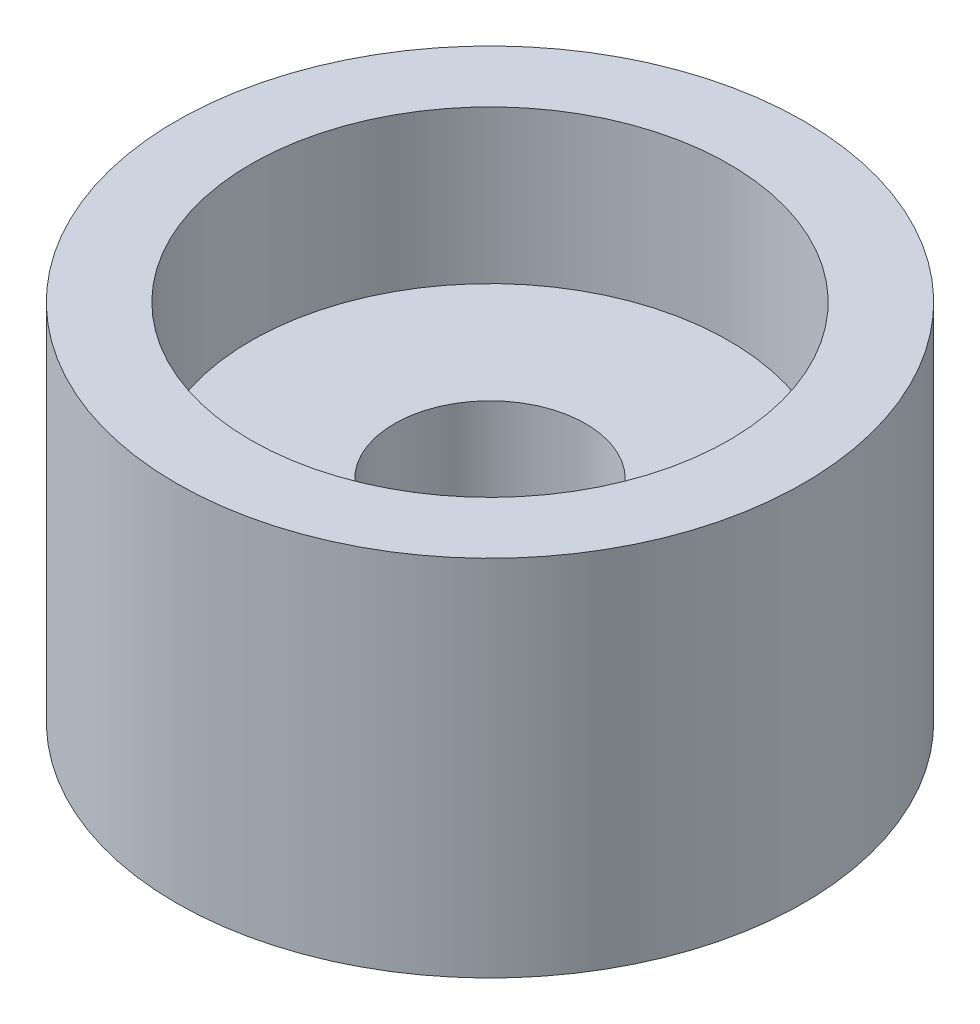
ISO-10303-21;
HEADER;
FILE_DESCRIPTION(('STEP AP214'),'2;1');
FILE_NAME('part.step','',(''),(''),'','','');
FILE_SCHEMA(('AUTOMOTIVE_DESIGN { 1 0 10303 214 1 1 1 1 }'));
ENDSEC;
DATA;
#1=APPLICATION_CONTEXT('core data for automotive mechanical design processes');
#2=APPLICATION_PROTOCOL_DEFINITION('international standard','automotive_design',2000,#1);
#3=PRODUCT_CONTEXT('',#1,'mechanical');
#4=PRODUCT('Part','Part','',(#3));
#5=PRODUCT_RELATED_PRODUCT_CATEGORY('part','',(#4));
#6=PRODUCT_DEFINITION_FORMATION('','',#4);
#7=PRODUCT_DEFINITION_CONTEXT('part definition',#1,'design');
#8=PRODUCT_DEFINITION('design','',#6,#7);
#9=PRODUCT_DEFINITION_SHAPE('','',#8);
#10=(LENGTH_UNIT() NAMED_UNIT(*) SI_UNIT(.MILLI.,.METRE.));
#11=(NAMED_UNIT(*) PLANE_ANGLE_UNIT() SI_UNIT($,.RADIAN.));
#12=(NAMED_UNIT(*) SI_UNIT($,.STERADIAN.) SOLID_ANGLE_UNIT());
#13=UNCERTAINTY_MEASURE_WITH_UNIT(LENGTH_MEASURE(1.E-05),#10,'distance_accuracy_value','');
#14=(GEOMETRIC_REPRESENTATION_CONTEXT(3) GLOBAL_UNCERTAINTY_ASSIGNED_CONTEXT((#13)) GLOBAL_UNIT_ASSIGNED_CONTEXT((#10,
#11,#12)) REPRESENTATION_CONTEXT('',''));
#15=CARTESIAN_POINT('',(0.,0.,0.));
#16=DIRECTION('',(0.,0.,1.));
#17=DIRECTION('',(1.,0.,0.));
#18=AXIS2_PLACEMENT_3D('',#15,#16,#17);
#19=CARTESIAN_POINT('',(0.,9.5,0.));
#20=DIRECTION('',(0.,-1.,0.));
#21=DIRECTION('',(0.,0.,-1.));
#22=AXIS2_PLACEMENT_3D('',#19,#20,#21);
#23=CYLINDRICAL_SURFACE('',#22,8.2);
#24=CARTESIAN_POINT('',(0.,9.5,0.));
#25=DIRECTION('',(0.,1.,0.));
#26=DIRECTION('',(0.,0.,1.));
#27=AXIS2_PLACEMENT_3D('',#24,#25,#26);
#28=CIRCLE('',#27,8.2);
#29=CARTESIAN_POINT('',(0.,9.5,8.2));
#30=VERTEX_POINT('',#29);
#31=EDGE_CURVE('E10',#30,#30,#28,.T.);
#32=ORIENTED_EDGE('',*,*,#31,.F.);
#33=EDGE_LOOP('',(#32));
#34=FACE_BOUND('',#33,.T.);
#35=CARTESIAN_POINT('',(0.,0.,0.));
#36=DIRECTION('',(0.,1.,0.));
#37=DIRECTION('',(0.,0.,1.));
#38=AXIS2_PLACEMENT_3D('',#35,#36,#37);
#39=CIRCLE('',#38,8.2);
#40=CARTESIAN_POINT('',(0.,0.,8.2));
#41=VERTEX_POINT('',#40);
#42=EDGE_CURVE('E39',#41,#41,#39,.T.);
#43=ORIENTED_EDGE('',*,*,#42,.T.);
#44=EDGE_LOOP('',(#43));
#45=FACE_BOUND('',#44,.T.);
#46=ADVANCED_FACE('F36',(#34,#45),#23,.T.);
#47=CARTESIAN_POINT('',(0.,9.5,0.));
#48=DIRECTION('',(0.,1.,0.));
#49=DIRECTION('',(0.,0.,1.));
#50=AXIS2_PLACEMENT_3D('',#47,#48,#49);
#51=PLANE('',#50);
#52=CARTESIAN_POINT('',(0.,9.5,0.));
#53=DIRECTION('',(0.,1.,0.));
#54=DIRECTION('',(0.,0.,1.));
#55=AXIS2_PLACEMENT_3D('',#52,#53,#54);
#56=CIRCLE('',#55,6.25);
#57=CARTESIAN_POINT('',(0.,9.5,6.25));
#58=VERTEX_POINT('',#57);
#59=EDGE_CURVE('E48',#58,#58,#56,.T.);
#60=ORIENTED_EDGE('',*,*,#59,.F.);
#61=EDGE_LOOP('',(#60));
#62=FACE_BOUND('',#61,.T.);
#63=ORIENTED_EDGE('',*,*,#31,.T.);
#64=EDGE_LOOP('',(#63));
#65=FACE_BOUND('',#64,.T.);
#66=ADVANCED_FACE('F81',(#62,#65),#51,.T.);
#67=CARTESIAN_POINT('',(0.,0.,0.));
#68=DIRECTION('',(0.,1.,0.));
#69=DIRECTION('',(0.,0.,1.));
#70=AXIS2_PLACEMENT_3D('',#67,#68,#69);
#71=PLANE('',#70);
#72=CARTESIAN_POINT('',(0.,0.,0.));
#73=DIRECTION('',(0.,1.,0.));
#74=DIRECTION('',(0.,0.,1.));
#75=AXIS2_PLACEMENT_3D('',#72,#73,#74);
#76=CIRCLE('',#75,2.5);
#77=CARTESIAN_POINT('',(0.,0.,2.5));
#78=VERTEX_POINT('',#77);
#79=EDGE_CURVE('E51',#78,#78,#76,.T.);
#80=ORIENTED_EDGE('',*,*,#79,.T.);
#81=EDGE_LOOP('',(#80));
#82=FACE_BOUND('',#81,.T.);
#83=ORIENTED_EDGE('',*,*,#42,.F.);
#84=EDGE_LOOP('',(#83));
#85=FACE_BOUND('',#84,.T.);
#86=ADVANCED_FACE('F60',(#82,#85),#71,.F.);
#87=CARTESIAN_POINT('',(0.,5.5,0.));
#88=DIRECTION('',(0.,1.,0.));
#89=DIRECTION('',(0.,0.,1.));
#90=AXIS2_PLACEMENT_3D('',#87,#88,#89);
#91=CYLINDRICAL_SURFACE('',#90,6.25);
#92=CARTESIAN_POINT('',(0.,5.5,0.));
#93=DIRECTION('',(0.,1.,0.));
#94=DIRECTION('',(0.,0.,1.));
#95=AXIS2_PLACEMENT_3D('',#92,#93,#94);
#96=CIRCLE('',#95,6.25);
#97=CARTESIAN_POINT('',(0.,5.5,6.25));
#98=VERTEX_POINT('',#97);
#99=EDGE_CURVE('E46',#98,#98,#96,.T.);
#100=ORIENTED_EDGE('',*,*,#99,.F.);
#101=EDGE_LOOP('',(#100));
#102=FACE_BOUND('',#101,.T.);
#103=ORIENTED_EDGE('',*,*,#59,.T.);
#104=EDGE_LOOP('',(#103));
#105=FACE_BOUND('',#104,.T.);
#106=ADVANCED_FACE('F72',(#102,#105),#91,.F.);
#107=CARTESIAN_POINT('',(0.,5.5,0.));
#108=DIRECTION('',(0.,1.,0.));
#109=DIRECTION('',(0.,0.,1.));
#110=AXIS2_PLACEMENT_3D('',#107,#108,#109);
#111=PLANE('',#110);
#112=CARTESIAN_POINT('',(0.,5.5,0.));
#113=DIRECTION('',(0.,1.,0.));
#114=DIRECTION('',(0.,0.,1.));
#115=AXIS2_PLACEMENT_3D('',#112,#113,#114);
#116=CIRCLE('',#115,2.5);
#117=CARTESIAN_POINT('',(0.,5.5,2.5));
#118=VERTEX_POINT('',#117);
#119=EDGE_CURVE('E54',#118,#118,#116,.T.);
#120=ORIENTED_EDGE('',*,*,#119,.F.);
#121=EDGE_LOOP('',(#120));
#122=FACE_BOUND('',#121,.T.);
#123=ORIENTED_EDGE('',*,*,#99,.T.);
#124=EDGE_LOOP('',(#123));
#125=FACE_BOUND('',#124,.T.);
#126=ADVANCED_FACE('F66',(#122,#125),#111,.T.);
#127=CARTESIAN_POINT('',(0.,0.,0.));
#128=DIRECTION('',(0.,1.,0.));
#129=DIRECTION('',(0.,0.,1.));
#130=AXIS2_PLACEMENT_3D('',#127,#128,#129);
#131=CYLINDRICAL_SURFACE('',#130,2.5);
#132=ORIENTED_EDGE('',*,*,#79,.F.);
#133=EDGE_LOOP('',(#132));
#134=FACE_BOUND('',#133,.T.);
#135=ORIENTED_EDGE('',*,*,#119,.T.);
#136=EDGE_LOOP('',(#135));
#137=FACE_BOUND('',#136,.T.);
#138=ADVANCED_FACE('F63',(#134,#137),#131,.F.);
#139=CLOSED_SHELL('',(#46,#66,#86,#106,#126,#138));
#140=MANIFOLD_SOLID_BREP('B2',#139);
#141=ADVANCED_BREP_SHAPE_REPRESENTATION('',(#18,#140),#14);
#142=SHAPE_DEFINITION_REPRESENTATION(#9,#141);
ENDSEC;
END-ISO-10303-21;
